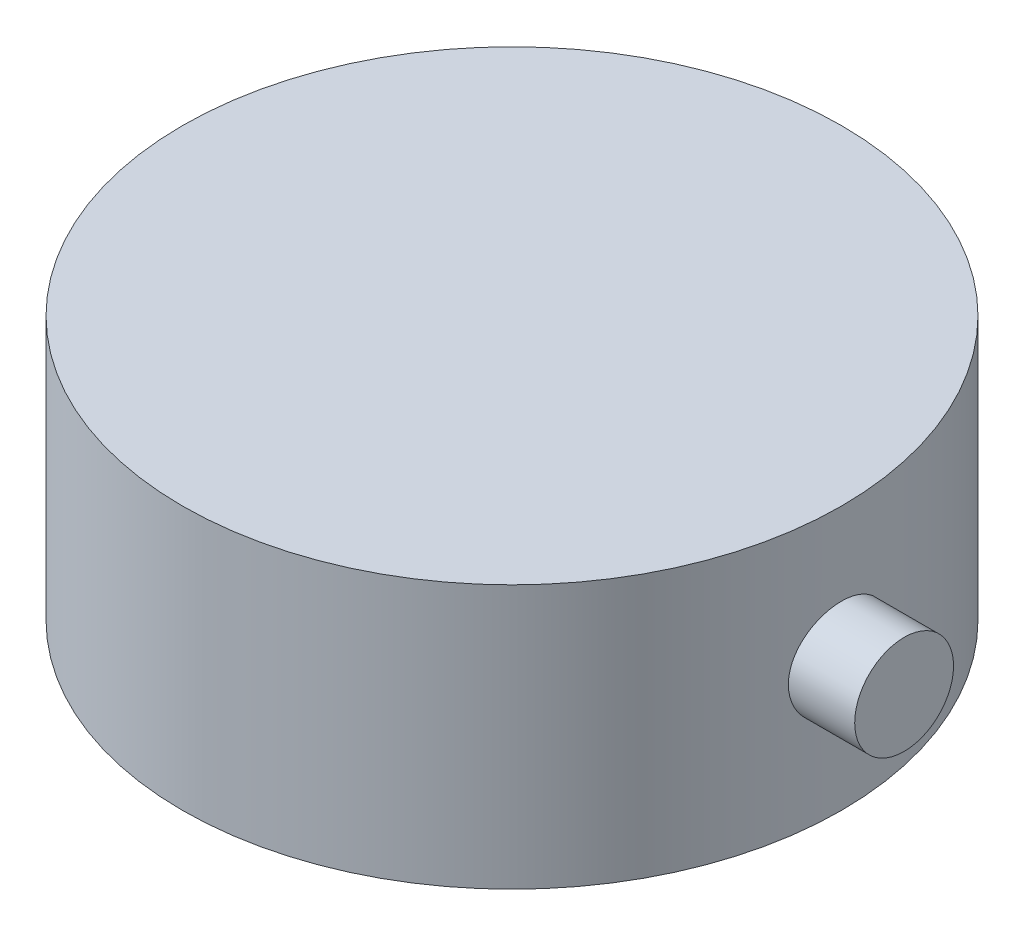
ISO-10303-21;
HEADER;
FILE_DESCRIPTION(('STEP AP214'),'2;1');
FILE_NAME('part.step','',(''),(''),'','','');
FILE_SCHEMA(('AUTOMOTIVE_DESIGN { 1 0 10303 214 1 1 1 1 }'));
ENDSEC;
DATA;
#1=APPLICATION_CONTEXT('core data for automotive mechanical design processes');
#2=APPLICATION_PROTOCOL_DEFINITION('international standard','automotive_design',2000,#1);
#3=PRODUCT_CONTEXT('',#1,'mechanical');
#4=PRODUCT('Part','Part','',(#3));
#5=PRODUCT_RELATED_PRODUCT_CATEGORY('part','',(#4));
#6=PRODUCT_DEFINITION_FORMATION('','',#4);
#7=PRODUCT_DEFINITION_CONTEXT('part definition',#1,'design');
#8=PRODUCT_DEFINITION('design','',#6,#7);
#9=PRODUCT_DEFINITION_SHAPE('','',#8);
#10=(LENGTH_UNIT() NAMED_UNIT(*) SI_UNIT(.MILLI.,.METRE.));
#11=(NAMED_UNIT(*) PLANE_ANGLE_UNIT() SI_UNIT($,.RADIAN.));
#12=(NAMED_UNIT(*) SI_UNIT($,.STERADIAN.) SOLID_ANGLE_UNIT());
#13=UNCERTAINTY_MEASURE_WITH_UNIT(LENGTH_MEASURE(1.E-05),#10,'distance_accuracy_value','');
#14=(GEOMETRIC_REPRESENTATION_CONTEXT(3) GLOBAL_UNCERTAINTY_ASSIGNED_CONTEXT((#13)) GLOBAL_UNIT_ASSIGNED_CONTEXT((#10,
#11,#12)) REPRESENTATION_CONTEXT('',''));
#15=CARTESIAN_POINT('',(0.,0.,0.));
#16=DIRECTION('',(0.,0.,1.));
#17=DIRECTION('',(1.,0.,0.));
#18=AXIS2_PLACEMENT_3D('',#15,#16,#17);
#19=CARTESIAN_POINT('',(-8.88095785175469E-07,-14.6240061954613,5.76640367314016E-09));
#20=DIRECTION('',(3.55160345577587E-13,1.,0.));
#21=DIRECTION('',(0.,0.,1.));
#22=AXIS2_PLACEMENT_3D('',#19,#20,#21);
#23=CYLINDRICAL_SURFACE('',#22,37.5);
#24=CARTESIAN_POINT('',(-8.88095785175469E-07,-14.6240061954613,5.76640367314016E-09));
#25=DIRECTION('',(-3.55160345577587E-13,-1.,0.));
#26=DIRECTION('',(0.,0.,-1.));
#27=AXIS2_PLACEMENT_3D('',#24,#25,#26);
#28=CIRCLE('',#27,37.5);
#29=CARTESIAN_POINT('',(-8.88095916106019E-07,-14.6240061954613,-37.4999999942336));
#30=VERTEX_POINT('',#29);
#31=EDGE_CURVE('E53',#30,#30,#28,.T.);
#32=ORIENTED_EDGE('',*,*,#31,.F.);
#33=EDGE_LOOP('',(#32));
#34=FACE_BOUND('',#33,.T.);
#35=CARTESIAN_POINT('',(-8.88085130365102E-07,15.3759938045387,5.76640367314016E-09));
#36=DIRECTION('',(-3.55160345577587E-13,-1.,0.));
#37=DIRECTION('',(0.,0.,-1.));
#38=AXIS2_PLACEMENT_3D('',#35,#36,#37);
#39=CIRCLE('',#38,37.5);
#40=CARTESIAN_POINT('',(-8.88085261295652E-07,15.3759938045387,-37.4999999942336));
#41=VERTEX_POINT('',#40);
#42=EDGE_CURVE('E57',#41,#41,#39,.T.);
#43=ORIENTED_EDGE('',*,*,#42,.T.);
#44=EDGE_LOOP('',(#43));
#45=FACE_BOUND('',#44,.T.);
#46=CARTESIAN_POINT('',(-37.5000008880885,6.00099380455205,5.76653460369037E-09));
#47=CARTESIAN_POINT('',(-37.5000017361865,6.00099594646062,-0.157088530657447));
#48=CARTESIAN_POINT('',(-37.4990119359194,5.99441114464933,-0.314147048357185));
#49=CARTESIAN_POINT('',(-37.4950822089002,5.96812463128037,-0.627186991263352));
#50=CARTESIAN_POINT('',(-37.4921418717054,5.94842015900646,-0.783168182791356));
#51=CARTESIAN_POINT('',(-37.4843897568349,5.89602113139347,-1.09299047314969));
#52=CARTESIAN_POINT('',(-37.4795767062018,5.86331773984805,-1.2468300424026));
#53=CARTESIAN_POINT('',(-37.4682126850537,5.78515409097841,-1.55122848873183));
#54=CARTESIAN_POINT('',(-37.4616610773744,5.73968915631987,-1.70178614108179));
#55=CARTESIAN_POINT('',(-37.4470126229248,5.63640450668992,-1.99833149218185));
#56=CARTESIAN_POINT('',(-37.4389175357628,5.57859885157841,-2.14432417661874));
#57=CARTESIAN_POINT('',(-37.4213996200093,5.45100125900893,-2.43095517739011));
#58=CARTESIAN_POINT('',(-37.4119763024704,5.3812049054621,-2.57159149761706));
#59=CARTESIAN_POINT('',(-37.392071105091,5.23018140858273,-2.84641155317591));
#60=CARTESIAN_POINT('',(-37.3815897763798,5.14896020798776,-2.98059859477898));
#61=CARTESIAN_POINT('',(-37.359850514805,4.97560075588816,-3.24172963262178));
#62=CARTESIAN_POINT('',(-37.3485922943765,4.88345845280581,-3.36867091474676));
#63=CARTESIAN_POINT('',(-37.3255378682003,4.6882769210322,-3.61520696784722));
#64=CARTESIAN_POINT('',(-37.3137385945176,4.58516959633695,-3.73474754511656));
#65=CARTESIAN_POINT('',(-37.2899983069404,4.36924415633548,-3.96477875104434));
#66=CARTESIAN_POINT('',(-37.2780572422091,4.25642246156077,-4.07526601429578));
#67=CARTESIAN_POINT('',(-37.2543768774007,4.02191691654888,-4.28634440827586));
#68=CARTESIAN_POINT('',(-37.2426375159653,3.90023582252947,-4.38693859410541));
#69=CARTESIAN_POINT('',(-37.219683538196,3.64877262327403,-4.57760308644825));
#70=CARTESIAN_POINT('',(-37.2084691170104,3.51898754655049,-4.66766949756357));
#71=CARTESIAN_POINT('',(-37.186838550448,3.25164101971948,-4.83698522071439));
#72=CARTESIAN_POINT('',(-37.1764262895206,3.1140467266482,-4.91618319022443));
#73=CARTESIAN_POINT('',(-37.1567537120137,2.83254241535939,-5.06272530173801));
#74=CARTESIAN_POINT('',(-37.1474938253537,2.6886300669727,-5.13006502361765));
#75=CARTESIAN_POINT('',(-37.1304039216664,2.39560058050827,-5.25233210003525));
#76=CARTESIAN_POINT('',(-37.1225733157567,2.246485616278,-5.3072645687504));
#77=CARTESIAN_POINT('',(-37.1085620573262,1.94406203113409,-5.40435550707839));
#78=CARTESIAN_POINT('',(-37.1023820088722,1.79075189745106,-5.44650930074418));
#79=CARTESIAN_POINT('',(-37.086697625788,1.32860490670925,-5.55268450175177));
#80=CARTESIAN_POINT('',(-37.0798959774902,1.01500646311662,-5.59747768882395));
#81=CARTESIAN_POINT('',(-37.0743857255708,0.384847801004277,-5.63385208650512));
#82=CARTESIAN_POINT('',(-37.0756766572705,0.0682877535831072,-5.62543635238892));
#83=CARTESIAN_POINT('',(-37.0861411863024,-0.556247571931067,-5.55602320534023));
#84=CARTESIAN_POINT('',(-37.0952493221179,-0.864272273217576,-5.49546244298072));
#85=CARTESIAN_POINT('',(-37.1202234623545,-1.46572597536094,-5.32414304544937));
#86=CARTESIAN_POINT('',(-37.1360896579482,-1.75915456305934,-5.21338299022964));
#87=CARTESIAN_POINT('',(-37.1728635331599,-2.32443042236641,-4.94435981705846));
#88=CARTESIAN_POINT('',(-37.1937907834854,-2.5961883341775,-4.78591169688227));
#89=CARTESIAN_POINT('',(-37.238314905487,-3.10942367501343,-4.42614056954582));
#90=CARTESIAN_POINT('',(-37.2619119523286,-3.35089911501036,-4.22481474841274));
#91=CARTESIAN_POINT('',(-37.3094061322266,-3.79924735650908,-3.78260596210799));
#92=CARTESIAN_POINT('',(-37.3333039060353,-4.00574989115223,-3.54134747434538));
#93=CARTESIAN_POINT('',(-37.3784876736967,-4.37539096771985,-3.02740158738227));
#94=CARTESIAN_POINT('',(-37.3997736561122,-4.53852931975282,-2.75471405056164));
#95=CARTESIAN_POINT('',(-37.4373577228689,-4.81683026505322,-2.18532973591128));
#96=CARTESIAN_POINT('',(-37.4536528353795,-4.93196428866208,-1.88861878567823));
#97=CARTESIAN_POINT('',(-37.4793942838989,-5.11066640795502,-1.27977442900307));
#98=CARTESIAN_POINT('',(-37.4888410829122,-5.17423798973644,-0.967642066704871));
#99=CARTESIAN_POINT('',(-37.4997601806228,-5.24751830728028,-0.340010872749406));
#100=CARTESIAN_POINT('',(-37.5013078414403,-5.25773608936328,-0.0245727385943231));
#101=CARTESIAN_POINT('',(-37.4964594262051,-5.22536992428879,0.603512546846699));
#102=CARTESIAN_POINT('',(-37.4900635960706,-5.18278761174109,0.916159784232713));
#103=CARTESIAN_POINT('',(-37.4700934609914,-5.04645332470978,1.52824645909793));
#104=CARTESIAN_POINT('',(-37.4565539577307,-4.95294935376425,1.82774236901399));
#105=CARTESIAN_POINT('',(-37.4238097259422,-4.71768743653356,2.40680609897964));
#106=CARTESIAN_POINT('',(-37.4046047313695,-4.57592722414189,2.6863729824191));
#107=CARTESIAN_POINT('',(-37.3624764781813,-4.24698292263898,3.21988118448634));
#108=CARTESIAN_POINT('',(-37.3395271897835,-4.05947592992819,3.47362131673012));
#109=CARTESIAN_POINT('',(-37.2925457603601,-3.64480914229706,3.94621375631134));
#110=CARTESIAN_POINT('',(-37.2685135564617,-3.41764704284126,4.16506403462849));
#111=CARTESIAN_POINT('',(-37.2218357644589,-2.92785642297632,4.56351703151514));
#112=CARTESIAN_POINT('',(-37.1992033574312,-2.66494888608915,4.74277852043323));
#113=CARTESIAN_POINT('',(-37.1581217358416,-2.11244238350636,5.05459201678413));
#114=CARTESIAN_POINT('',(-37.1396724082614,-1.8228441392374,5.18714528623276));
#115=CARTESIAN_POINT('',(-37.1091391374482,-1.22625405881073,5.40125628259862));
#116=CARTESIAN_POINT('',(-37.0970328058209,-0.919327693782273,5.48299356417373));
#117=CARTESIAN_POINT('',(-37.080504544144,-0.295734164093595,5.59370344680239));
#118=CARTESIAN_POINT('',(-37.0760820834239,0.0209323263479687,5.62267969169266));
#119=CARTESIAN_POINT('',(-37.075579161956,0.494290818645588,5.62595227341099));
#120=CARTESIAN_POINT('',(-37.0764157997083,0.651093218305947,5.62045937502188));
#121=CARTESIAN_POINT('',(-37.0800547052762,0.963654141727502,5.59640943516332));
#122=CARTESIAN_POINT('',(-37.0828562374104,1.11941303416266,5.57785728323406));
#123=CARTESIAN_POINT('',(-37.090348660522,1.42883768952523,5.52781419996701));
#124=CARTESIAN_POINT('',(-37.0950402317713,1.58250267819535,5.49631860988277));
#125=CARTESIAN_POINT('',(-37.1061742640296,1.8865548722715,5.42064210232471));
#126=CARTESIAN_POINT('',(-37.1126160919815,2.03694324160768,5.37646577107201));
#127=CARTESIAN_POINT('',(-37.1270641907739,2.33338165959004,5.27577040210173));
#128=CARTESIAN_POINT('',(-37.1350698227967,2.47943345176677,5.21925640324557));
#129=CARTESIAN_POINT('',(-37.1524164817402,2.76620051074311,5.09430955095629));
#130=CARTESIAN_POINT('',(-37.1617570273754,2.9069176778358,5.02588099122802));
#131=CARTESIAN_POINT('',(-37.1815162889549,3.18215932179146,4.87755159903003));
#132=CARTESIAN_POINT('',(-37.1919354154674,3.31668141210046,4.79764639339015));
#133=CARTESIAN_POINT('',(-37.2135534112114,3.57851409027342,4.6269754557996));
#134=CARTESIAN_POINT('',(-37.2247520029862,3.70582721525542,4.53621358018219));
#135=CARTESIAN_POINT('',(-37.2477355680769,3.95366660343609,4.34347451108084));
#136=CARTESIAN_POINT('',(-37.2595252828584,4.07411233082752,4.24139430519925));
#137=CARTESIAN_POINT('',(-37.283249669053,4.30595057459501,4.02752143190858));
#138=CARTESIAN_POINT('',(-37.2951842868292,4.41734633010815,3.91573226940322));
#139=CARTESIAN_POINT('',(-37.318874957053,4.63042766714032,3.68311161543427));
#140=CARTESIAN_POINT('',(-37.3306308981995,4.73210738932135,3.56227474503348));
#141=CARTESIAN_POINT('',(-37.3536229873372,4.92493570147829,3.31249703515847));
#142=CARTESIAN_POINT('',(-37.3648593256984,5.01608816701512,3.18355920518035));
#143=CARTESIAN_POINT('',(-37.3865658183146,5.18776676066769,2.91764601886476));
#144=CARTESIAN_POINT('',(-37.3970310677786,5.26822710933315,2.78062777899294));
#145=CARTESIAN_POINT('',(-37.4168208479768,5.41727310637519,2.50026489353151));
#146=CARTESIAN_POINT('',(-37.426145797575,5.48586311892612,2.35692259743304));
#147=CARTESIAN_POINT('',(-37.4433876608447,5.61065319744578,2.06498038055239));
#148=CARTESIAN_POINT('',(-37.4513056040765,5.66686233025268,1.91638440035178));
#149=CARTESIAN_POINT('',(-37.4655145670994,5.76651930923043,1.61494985823649));
#150=CARTESIAN_POINT('',(-37.4718059510707,5.80997001226017,1.46211225450552));
#151=CARTESIAN_POINT('',(-37.4846538357003,5.89798958309209,1.09383837955054));
#152=CARTESIAN_POINT('',(-37.4903833422682,5.93657301476396,0.87691420050719));
#153=CARTESIAN_POINT('',(-37.4980562511802,5.98807346646418,0.439973705723191));
#154=CARTESIAN_POINT('',(-37.4999997005704,6.00099080542367,0.219957428439678));
#155=CARTESIAN_POINT('',(-37.5000008880885,6.00099380455205,5.76653460369037E-09));
#156=B_SPLINE_CURVE_WITH_KNOTS('',3,(#46,#47,#48,#49,#50,#51,#52,#53,#54,#55,#56,#57,#58,#59,
#60,#61,#62,#63,#64,#65,#66,#67,#68,#69,#70,#71,#72,#73,#74,#75,#76,#77,#78,#79,#80,#81,#82,#83,
#84,#85,#86,#87,#88,#89,#90,#91,#92,#93,#94,#95,#96,#97,#98,#99,#100,#101,#102,#103,#104,#105,
#106,#107,#108,#109,#110,#111,#112,#113,#114,#115,#116,#117,#118,#119,#120,#121,#122,#123,#124,
#125,#126,#127,#128,#129,#130,#131,#132,#133,#134,#135,#136,#137,#138,#139,#140,#141,#142,#143,
#144,#145,#146,#147,#148,#149,#150,#151,#152,#153,#154,#155),.UNSPECIFIED.,.T.,.F.,(4,2,2,2,2,2,
2,2,2,2,2,2,2,2,2,2,2,2,2,2,2,2,2,2,2,2,2,2,2,2,2,2,2,2,2,2,2,2,2,2,2,2,2,2,2,2,2,2,2,2,2,2,2,2,
4),(0.,0.471072951021485,0.942245059253242,1.41373800290331,1.88540398332945,2.35653543251351,
2.82784076949853,3.29890185312214,3.77013824412454,4.24449404655868,4.71902538975521,
5.19340972878253,5.66796904354235,6.14469820956199,6.62160470043582,7.09831425380168,
7.57519803379333,8.52079084805901,9.46632936654869,10.4040263201773,11.3417498012254,
12.2831590556928,13.2246301119069,14.1755180974147,15.1264102467869,16.0778675122696,
17.0292604450894,17.9715593707464,18.9138291250052,19.8515502615599,20.7893154394471,
21.7339017267209,22.6785429264105,23.631033422262,24.583498180668,25.5325780549806,
26.481592380481,26.9518367273934,27.4219051028005,27.8921428188444,28.3622106786696,
28.8320869147257,29.3017941684833,29.7716808811496,30.241401181027,30.7158154563946,
31.1900591759068,31.6645871107294,32.1389397896271,32.6160875430993,33.0930594969757,
33.5696809819785,34.0461956606936,34.7058063625949,35.3654088680129),.UNSPECIFIED.);
#157=CARTESIAN_POINT('',(-37.5000008880885,6.00099380455205,5.76653460369037E-09));
#158=VERTEX_POINT('',#157);
#159=EDGE_CURVE('E49',#158,#158,#156,.T.);
#160=ORIENTED_EDGE('',*,*,#159,.F.);
#161=EDGE_LOOP('',(#160));
#162=FACE_BOUND('',#161,.T.);
#163=CARTESIAN_POINT('',(37.4999991119115,6.00099380452541,5.76627274258996E-09));
#164=CARTESIAN_POINT('',(37.4999999600096,6.00099594643398,0.157088542190254));
#165=CARTESIAN_POINT('',(37.4990101597425,5.99441114462269,0.314147059889993));
#166=CARTESIAN_POINT('',(37.4950804327233,5.96812463125373,0.62718700279616));
#167=CARTESIAN_POINT('',(37.4921400955285,5.94842015897983,0.783168194324164));
#168=CARTESIAN_POINT('',(37.4843879806579,5.89602113136684,1.0929904846825));
#169=CARTESIAN_POINT('',(37.4795749300248,5.86331773982142,1.24683005393541));
#170=CARTESIAN_POINT('',(37.4682109088766,5.78515409095179,1.55122850026464));
#171=CARTESIAN_POINT('',(37.4616593011973,5.73968915629326,1.7017861526146));
#172=CARTESIAN_POINT('',(37.4470108467476,5.63640450666332,1.99833150371465));
#173=CARTESIAN_POINT('',(37.4389157595855,5.57859885155182,2.14432418815155));
#174=CARTESIAN_POINT('',(37.421397843832,5.45100125898235,2.43095518892292));
#175=CARTESIAN_POINT('',(37.4119745262931,5.38120490543552,2.57159150914987));
#176=CARTESIAN_POINT('',(37.3920693289135,5.23018140855617,2.84641156470872));
#177=CARTESIAN_POINT('',(37.3815880002023,5.1489602079612,2.98059860631178));
#178=CARTESIAN_POINT('',(37.3598487386274,4.97560075586162,3.24172964415459));
#179=CARTESIAN_POINT('',(37.3485905181988,4.88345845277928,3.36867092627956));
#180=CARTESIAN_POINT('',(37.3255360920224,4.68827692100568,3.61520697938003));
#181=CARTESIAN_POINT('',(37.3137368183397,4.58516959631045,3.73474755664937));
#182=CARTESIAN_POINT('',(37.2899965307623,4.36924415630899,3.96477876257714));
#183=CARTESIAN_POINT('',(37.2780554660309,4.25642246153429,4.07526602582858));
#184=CARTESIAN_POINT('',(37.2543751012224,4.02191691652242,4.28634441980867));
#185=CARTESIAN_POINT('',(37.2426357397869,3.90023582250301,4.38693860563822));
#186=CARTESIAN_POINT('',(37.2196817620174,3.64877262324759,4.57760309798105));
#187=CARTESIAN_POINT('',(37.2084673408317,3.51898754652406,4.66766950909638));
#188=CARTESIAN_POINT('',(37.1868367742692,3.25164101969306,4.83698523224719));
#189=CARTESIAN_POINT('',(37.1764245133417,3.11404672662179,4.91618320175724));
#190=CARTESIAN_POINT('',(37.1567519358346,2.83254241533299,5.06272531327081));
#191=CARTESIAN_POINT('',(37.1474920491744,2.68863006694632,5.13006503515046));
#192=CARTESIAN_POINT('',(37.130402145487,2.3956005804819,5.25233211156806));
#193=CARTESIAN_POINT('',(37.1225715395771,2.24648561625163,5.3072645802832));
#194=CARTESIAN_POINT('',(37.1085602811464,1.94406203110773,5.4043555186112));
#195=CARTESIAN_POINT('',(37.1023802326923,1.79075189742471,5.44650931227699));
#196=CARTESIAN_POINT('',(37.0866958496077,1.3286049066829,5.55268451328458));
#197=CARTESIAN_POINT('',(37.0798942013097,1.01500646309028,5.59747770035676));
#198=CARTESIAN_POINT('',(37.0743839493899,0.384847800977943,5.63385209803793));
#199=CARTESIAN_POINT('',(37.0756748810894,0.0682877535567718,5.62543636392172));
#200=CARTESIAN_POINT('',(37.0861394101208,-0.55624757195741,5.55602321687303));
#201=CARTESIAN_POINT('',(37.0952475459361,-0.864272273243925,5.49546245451353));
#202=CARTESIAN_POINT('',(37.1202216861723,-1.46572597538731,5.32414305698218));
#203=CARTESIAN_POINT('',(37.1360878817658,-1.75915456308572,5.21338300176244));
#204=CARTESIAN_POINT('',(37.172861756977,-2.32443042239281,4.94435982859127));
#205=CARTESIAN_POINT('',(37.1937890073024,-2.59618833420391,4.78591170841508));
#206=CARTESIAN_POINT('',(37.2383131293037,-3.10942367503988,4.42614058107863));
#207=CARTESIAN_POINT('',(37.2619101761451,-3.35089911503683,4.22481475994555));
#208=CARTESIAN_POINT('',(37.3094043560427,-3.79924735653559,3.7826059736408));
#209=CARTESIAN_POINT('',(37.3333021298513,-4.00574989117875,3.54134748587819));
#210=CARTESIAN_POINT('',(37.3784858975124,-4.3753909677464,3.02740159891508));
#211=CARTESIAN_POINT('',(37.3997718799278,-4.53852931977938,2.75471406209445));
#212=CARTESIAN_POINT('',(37.4373559466843,-4.81683026507981,2.18532974744408));
#213=CARTESIAN_POINT('',(37.4536510591949,-4.93196428868869,1.88861879721104));
#214=CARTESIAN_POINT('',(37.4793925077141,-5.11066640798165,1.27977444053587));
#215=CARTESIAN_POINT('',(37.4888393067274,-5.17423798976307,0.967642078237678));
#216=CARTESIAN_POINT('',(37.4997584044378,-5.24751830730692,0.340010884282213));
#217=CARTESIAN_POINT('',(37.5013060652554,-5.25773608938992,0.0245727501271306));
#218=CARTESIAN_POINT('',(37.4964576500202,-5.22536992431542,-0.603512535313892));
#219=CARTESIAN_POINT('',(37.4900618198858,-5.18278761176772,-0.916159772699906));
#220=CARTESIAN_POINT('',(37.4700916848066,-5.04645332473639,-1.52824644756512));
#221=CARTESIAN_POINT('',(37.456552181546,-4.95294935379086,-1.82774235748118));
#222=CARTESIAN_POINT('',(37.4238079497577,-4.71768743656014,-2.40680608744684));
#223=CARTESIAN_POINT('',(37.404602955185,-4.57592722416846,-2.68637297088629));
#224=CARTESIAN_POINT('',(37.3624747019971,-4.24698292266551,-3.21988117295353));
#225=CARTESIAN_POINT('',(37.3395254135994,-4.05947592995471,-3.47362130519731));
#226=CARTESIAN_POINT('',(37.2925439841763,-3.64480914232355,-3.94621374477853));
#227=CARTESIAN_POINT('',(37.2685117802781,-3.41764704286774,-4.16506402309568));
#228=CARTESIAN_POINT('',(37.2218339882757,-2.92785642300276,-4.56351701998234));
#229=CARTESIAN_POINT('',(37.1992015812481,-2.66494888611557,-4.74277850890042));
#230=CARTESIAN_POINT('',(37.1581199596589,-2.11244238353275,-5.05459200525132));
#231=CARTESIAN_POINT('',(37.1396706320789,-1.82284413926378,-5.18714527469995));
#232=CARTESIAN_POINT('',(37.1091373612662,-1.22625405883709,-5.40125627106582));
#233=CARTESIAN_POINT('',(37.0970310296391,-0.919327693808624,-5.48299355264092));
#234=CARTESIAN_POINT('',(37.0805027679626,-0.295734164119935,-5.59370343526958));
#235=CARTESIAN_POINT('',(37.0760803072427,0.0209323263216326,-5.62267968015986));
#236=CARTESIAN_POINT('',(37.0755773857752,0.494290818619252,-5.62595226187818));
#237=CARTESIAN_POINT('',(37.0764140235276,0.651093218279609,-5.62045936348908));
#238=CARTESIAN_POINT('',(37.0800529290957,0.963654141701161,-5.59640942363051));
#239=CARTESIAN_POINT('',(37.0828544612301,1.11941303413632,-5.57785727170125));
#240=CARTESIAN_POINT('',(37.0903468843419,1.42883768949889,-5.52781418843421));
#241=CARTESIAN_POINT('',(37.0950384555912,1.582502678169,-5.49631859834996));
#242=CARTESIAN_POINT('',(37.1061724878498,1.88655487224514,-5.42064209079191));
#243=CARTESIAN_POINT('',(37.1126143158018,2.03694324158132,-5.3764657595392));
#244=CARTESIAN_POINT('',(37.1270624145943,2.33338165956367,-5.27577039056892));
#245=CARTESIAN_POINT('',(37.1350680466173,2.47943345174039,-5.21925639171276));
#246=CARTESIAN_POINT('',(37.152414705561,2.76620051071672,-5.09430953942348));
#247=CARTESIAN_POINT('',(37.1617552511963,2.90691767780941,-5.02588097969521));
#248=CARTESIAN_POINT('',(37.181514512776,3.18215932176505,-4.87755158749722));
#249=CARTESIAN_POINT('',(37.1919336392886,3.31668141207404,-4.79764638185735));
#250=CARTESIAN_POINT('',(37.2135516350328,3.57851409024699,-4.6269754442668));
#251=CARTESIAN_POINT('',(37.2247502268077,3.70582721522897,-4.53621356864938));
#252=CARTESIAN_POINT('',(37.2477337918986,3.95366660340963,-4.34347449954803));
#253=CARTESIAN_POINT('',(37.2595235066801,4.07411233080105,-4.24139429366644));
#254=CARTESIAN_POINT('',(37.2832478928749,4.30595057456853,-4.02752142037577));
#255=CARTESIAN_POINT('',(37.2951825106511,4.41734633008166,-3.91573225787042));
#256=CARTESIAN_POINT('',(37.3188731808751,4.63042766711381,-3.68311160390147));
#257=CARTESIAN_POINT('',(37.3306291220217,4.73210738929483,-3.56227473350067));
#258=CARTESIAN_POINT('',(37.3536212111595,4.92493570145175,-3.31249702362566));
#259=CARTESIAN_POINT('',(37.3648575495208,5.01608816698858,-3.18355919364754));
#260=CARTESIAN_POINT('',(37.3865640421371,5.18776676064113,-2.91764600733195));
#261=CARTESIAN_POINT('',(37.3970292916011,5.26822710930658,-2.78062776746014));
#262=CARTESIAN_POINT('',(37.4168190717994,5.41727310634861,-2.50026488199871));
#263=CARTESIAN_POINT('',(37.4261440213977,5.48586311889953,-2.35692258590024));
#264=CARTESIAN_POINT('',(37.4433858846675,5.61065319741918,-2.06498036901959));
#265=CARTESIAN_POINT('',(37.4513038278994,5.66686233022608,-1.91638438881897));
#266=CARTESIAN_POINT('',(37.4655127909223,5.76651930920382,-1.61494984670369));
#267=CARTESIAN_POINT('',(37.4718041748937,5.80997001223355,-1.46211224297271));
#268=CARTESIAN_POINT('',(37.4846520595233,5.89798958306547,-1.09383836801773));
#269=CARTESIAN_POINT('',(37.4903815660913,5.93657301473733,-0.876914188974383));
#270=CARTESIAN_POINT('',(37.4980544750033,5.98807346643755,-0.439973694190384));
#271=CARTESIAN_POINT('',(37.4999979243935,6.00099080539704,-0.219957416906871));
#272=CARTESIAN_POINT('',(37.4999991119115,6.00099380452541,5.76627274258996E-09));
#273=B_SPLINE_CURVE_WITH_KNOTS('',3,(#163,#164,#165,#166,#167,#168,#169,#170,#171,#172,#173,
#174,#175,#176,#177,#178,#179,#180,#181,#182,#183,#184,#185,#186,#187,#188,#189,#190,#191,#192,
#193,#194,#195,#196,#197,#198,#199,#200,#201,#202,#203,#204,#205,#206,#207,#208,#209,#210,#211,
#212,#213,#214,#215,#216,#217,#218,#219,#220,#221,#222,#223,#224,#225,#226,#227,#228,#229,#230,
#231,#232,#233,#234,#235,#236,#237,#238,#239,#240,#241,#242,#243,#244,#245,#246,#247,#248,#249,
#250,#251,#252,#253,#254,#255,#256,#257,#258,#259,#260,#261,#262,#263,#264,#265,#266,#267,#268,
#269,#270,#271,#272),.UNSPECIFIED.,.T.,.F.,(4,2,2,2,2,2,2,2,2,2,2,2,2,2,2,2,2,2,2,2,2,2,2,2,2,2,
2,2,2,2,2,2,2,2,2,2,2,2,2,2,2,2,2,2,2,2,2,2,2,2,2,2,2,2,4),(0.,0.471072951021485,
0.942245059253242,1.41373800290331,1.88540398332945,2.35653543251351,2.82784076949852,
3.29890185312214,3.77013824412454,4.24449404655868,4.71902538975521,5.19340972878253,
5.66796904354235,6.14469820956199,6.62160470043582,7.09831425380168,7.57519803379333,
8.52079084805901,9.46632936654869,10.4040263201773,11.3417498012254,12.2831590556928,
13.2246301119069,14.1755180974147,15.1264102467869,16.0778675122696,17.0292604450894,
17.9715593707464,18.9138291250052,19.8515502615599,20.7893154394471,21.7339017267209,
22.6785429264105,23.631033422262,24.5834981806681,25.5325780549807,26.481592380481,
26.9518367273934,27.4219051028005,27.8921428188444,28.3622106786696,28.8320869147257,
29.3017941684833,29.7716808811496,30.241401181027,30.7158154563946,31.1900591759068,
31.6645871107294,32.1389397896271,32.6160875430993,33.0930594969757,33.5696809819785,
34.0461956606936,34.7058063625949,35.3654088680129),.UNSPECIFIED.);
#274=CARTESIAN_POINT('',(37.4999991119115,6.00099380452541,5.76627274258996E-09));
#275=VERTEX_POINT('',#274);
#276=EDGE_CURVE('E10',#275,#275,#273,.T.);
#277=ORIENTED_EDGE('',*,*,#276,.F.);
#278=EDGE_LOOP('',(#277));
#279=FACE_BOUND('',#278,.T.);
#280=ADVANCED_FACE('F38',(#34,#45,#162,#279),#23,.T.);
#281=CARTESIAN_POINT('',(-8.88095785175469E-07,-14.6240061954613,5.76640367314016E-09));
#282=DIRECTION('',(-3.55160345577587E-13,-1.,0.));
#283=DIRECTION('',(0.,0.,-1.));
#284=AXIS2_PLACEMENT_3D('',#281,#282,#283);
#285=PLANE('',#284);
#286=CARTESIAN_POINT('',(-8.88095785175469E-07,-14.6240061954613,5.76640367314016E-09));
#287=DIRECTION('',(-3.55160345577587E-13,-1.,0.));
#288=DIRECTION('',(0.,0.,-1.));
#289=AXIS2_PLACEMENT_3D('',#286,#287,#288);
#290=CIRCLE('',#289,30.);
#291=CARTESIAN_POINT('',(-8.88095889919909E-07,-14.6240061954613,-29.9999999942336));
#292=VERTEX_POINT('',#291);
#293=EDGE_CURVE('E102',#292,#292,#290,.T.);
#294=ORIENTED_EDGE('',*,*,#293,.F.);
#295=EDGE_LOOP('',(#294));
#296=FACE_BOUND('',#295,.T.);
#297=ORIENTED_EDGE('',*,*,#31,.T.);
#298=EDGE_LOOP('',(#297));
#299=FACE_BOUND('',#298,.T.);
#300=ADVANCED_FACE('F83',(#296,#299),#285,.T.);
#301=CARTESIAN_POINT('',(-8.88085130365102E-07,15.3759938045387,5.76640367314016E-09));
#302=DIRECTION('',(-3.55160345577587E-13,-1.,0.));
#303=DIRECTION('',(0.,0.,-1.));
#304=AXIS2_PLACEMENT_3D('',#301,#302,#303);
#305=PLANE('',#304);
#306=ORIENTED_EDGE('',*,*,#42,.F.);
#307=EDGE_LOOP('',(#306));
#308=FACE_BOUND('',#307,.T.);
#309=ADVANCED_FACE('F81',(#308),#305,.F.);
#310=CARTESIAN_POINT('',(-8.88094453324173E-07,-10.8740061954613,5.76640367314016E-09));
#311=DIRECTION('',(-3.55160345577587E-13,-1.,0.));
#312=DIRECTION('',(0.,0.,-1.));
#313=AXIS2_PLACEMENT_3D('',#310,#311,#312);
#314=CYLINDRICAL_SURFACE('',#313,30.);
#315=CARTESIAN_POINT('',(-8.88094453324173E-07,-10.8740061954613,5.76640367314016E-09));
#316=DIRECTION('',(-3.55160345577587E-13,-1.,0.));
#317=DIRECTION('',(0.,0.,-1.));
#318=AXIS2_PLACEMENT_3D('',#315,#316,#317);
#319=CIRCLE('',#318,30.);
#320=CARTESIAN_POINT('',(-8.88094558068613E-07,-10.8740061954613,-29.9999999942336));
#321=VERTEX_POINT('',#320);
#322=EDGE_CURVE('E100',#321,#321,#319,.T.);
#323=ORIENTED_EDGE('',*,*,#322,.F.);
#324=EDGE_LOOP('',(#323));
#325=FACE_BOUND('',#324,.T.);
#326=ORIENTED_EDGE('',*,*,#293,.T.);
#327=EDGE_LOOP('',(#326));
#328=FACE_BOUND('',#327,.T.);
#329=ADVANCED_FACE('F77',(#325,#328),#314,.F.);
#330=CARTESIAN_POINT('',(-8.88094453324173E-07,-10.8740061954613,5.76640367314016E-09));
#331=DIRECTION('',(-3.55160345577587E-13,-1.,0.));
#332=DIRECTION('',(0.,0.,-1.));
#333=AXIS2_PLACEMENT_3D('',#330,#331,#332);
#334=PLANE('',#333);
#335=ORIENTED_EDGE('',*,*,#322,.T.);
#336=EDGE_LOOP('',(#335));
#337=FACE_BOUND('',#336,.T.);
#338=ADVANCED_FACE('F73',(#337),#334,.T.);
#339=CARTESIAN_POINT('',(-44.6250008880904,0.375993804554581,5.76655948049491E-09));
#340=DIRECTION('',(1.,-3.55160345577587E-13,0.));
#341=DIRECTION('',(-3.55160345577587E-13,-1.,0.));
#342=AXIS2_PLACEMENT_3D('',#339,#340,#341);
#343=PLANE('',#342);
#344=CARTESIAN_POINT('',(-44.6250008880904,0.375993804554581,5.76655948049491E-09));
#345=DIRECTION('',(1.,-3.55160345577587E-13,0.));
#346=DIRECTION('',(-3.55160345577587E-13,-1.,0.));
#347=AXIS2_PLACEMENT_3D('',#344,#345,#346);
#348=CIRCLE('',#347,5.625);
#349=CARTESIAN_POINT('',(-44.6250008880924,-5.24900619544542,5.76655948049491E-09));
#350=VERTEX_POINT('',#349);
#351=EDGE_CURVE('E109',#350,#350,#348,.T.);
#352=ORIENTED_EDGE('',*,*,#351,.F.);
#353=EDGE_LOOP('',(#352));
#354=FACE_BOUND('',#353,.T.);
#355=ADVANCED_FACE('F71',(#354),#343,.F.);
#356=CARTESIAN_POINT('',(44.6249991119095,0.375993804522883,5.76624786578541E-09));
#357=DIRECTION('',(-1.,3.55160345577587E-13,0.));
#358=DIRECTION('',(3.55160345577587E-13,1.,0.));
#359=AXIS2_PLACEMENT_3D('',#356,#357,#358);
#360=CYLINDRICAL_SURFACE('',#359,5.625);
#361=ORIENTED_EDGE('',*,*,#351,.T.);
#362=EDGE_LOOP('',(#361));
#363=FACE_BOUND('',#362,.T.);
#364=ORIENTED_EDGE('',*,*,#159,.T.);
#365=EDGE_LOOP('',(#364));
#366=FACE_BOUND('',#365,.T.);
#367=ADVANCED_FACE('F69',(#363,#366),#360,.T.);
#368=CARTESIAN_POINT('',(44.6249991119095,0.375993804522883,5.76624786578541E-09));
#369=DIRECTION('',(1.,-3.55160345577587E-13,0.));
#370=DIRECTION('',(-3.55160345577587E-13,-1.,0.));
#371=AXIS2_PLACEMENT_3D('',#368,#369,#370);
#372=CIRCLE('',#371,5.625);
#373=CARTESIAN_POINT('',(44.6249991119075,-5.24900619547712,5.76624786578541E-09));
#374=VERTEX_POINT('',#373);
#375=EDGE_CURVE('E106',#374,#374,#372,.T.);
#376=ORIENTED_EDGE('',*,*,#375,.F.);
#377=EDGE_LOOP('',(#376));
#378=FACE_BOUND('',#377,.T.);
#379=ORIENTED_EDGE('',*,*,#276,.T.);
#380=EDGE_LOOP('',(#379));
#381=FACE_BOUND('',#380,.T.);
#382=ADVANCED_FACE('F63',(#378,#381),#360,.T.);
#383=CARTESIAN_POINT('',(44.6249991119095,0.375993804522883,5.76624786578541E-09));
#384=DIRECTION('',(1.,-3.55160345577587E-13,0.));
#385=DIRECTION('',(-3.55160345577587E-13,-1.,0.));
#386=AXIS2_PLACEMENT_3D('',#383,#384,#385);
#387=PLANE('',#386);
#388=ORIENTED_EDGE('',*,*,#375,.T.);
#389=EDGE_LOOP('',(#388));
#390=FACE_BOUND('',#389,.T.);
#391=ADVANCED_FACE('F68',(#390),#387,.T.);
#392=CLOSED_SHELL('',(#280,#300,#309,#329,#338,#355,#367,#382,#391));
#393=MANIFOLD_SOLID_BREP('B2',#392);
#394=ADVANCED_BREP_SHAPE_REPRESENTATION('',(#18,#393),#14);
#395=SHAPE_DEFINITION_REPRESENTATION(#9,#394);
ENDSEC;
END-ISO-10303-21;
